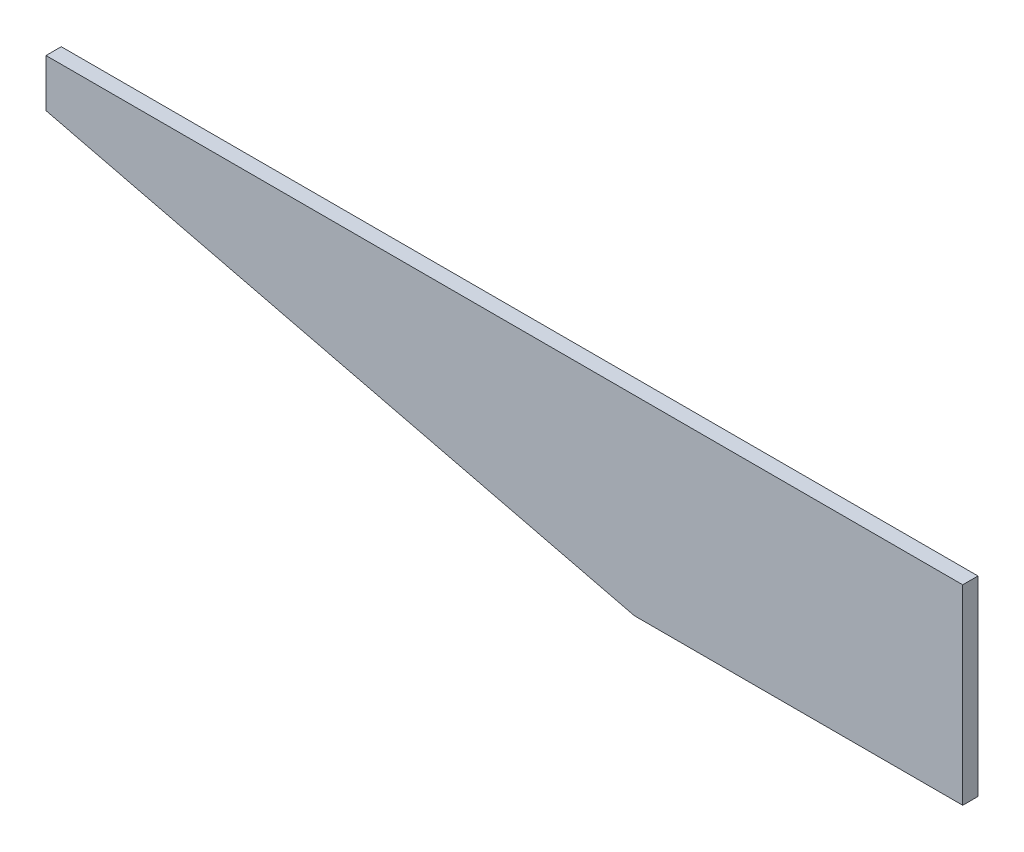
ISO-10303-21;
HEADER;
FILE_DESCRIPTION(('STEP AP214'),'2;1');
FILE_NAME('part.step','',(''),(''),'','','');
FILE_SCHEMA(('AUTOMOTIVE_DESIGN { 1 0 10303 214 1 1 1 1 }'));
ENDSEC;
DATA;
#1=APPLICATION_CONTEXT('core data for automotive mechanical design processes');
#2=APPLICATION_PROTOCOL_DEFINITION('international standard','automotive_design',2000,#1);
#3=PRODUCT_CONTEXT('',#1,'mechanical');
#4=PRODUCT('Part','Part','',(#3));
#5=PRODUCT_RELATED_PRODUCT_CATEGORY('part','',(#4));
#6=PRODUCT_DEFINITION_FORMATION('','',#4);
#7=PRODUCT_DEFINITION_CONTEXT('part definition',#1,'design');
#8=PRODUCT_DEFINITION('design','',#6,#7);
#9=PRODUCT_DEFINITION_SHAPE('','',#8);
#10=(LENGTH_UNIT() NAMED_UNIT(*) SI_UNIT(.MILLI.,.METRE.));
#11=(NAMED_UNIT(*) PLANE_ANGLE_UNIT() SI_UNIT($,.RADIAN.));
#12=(NAMED_UNIT(*) SI_UNIT($,.STERADIAN.) SOLID_ANGLE_UNIT());
#13=UNCERTAINTY_MEASURE_WITH_UNIT(LENGTH_MEASURE(1.E-05),#10,'distance_accuracy_value','');
#14=(GEOMETRIC_REPRESENTATION_CONTEXT(3) GLOBAL_UNCERTAINTY_ASSIGNED_CONTEXT((#13)) GLOBAL_UNIT_ASSIGNED_CONTEXT((#10,
#11,#12)) REPRESENTATION_CONTEXT('',''));
#15=CARTESIAN_POINT('',(0.,0.,0.));
#16=DIRECTION('',(0.,0.,1.));
#17=DIRECTION('',(1.,0.,0.));
#18=AXIS2_PLACEMENT_3D('',#15,#16,#17);
#19=CARTESIAN_POINT('',(-600.,-31.25,-10.));
#20=DIRECTION('',(-1.,0.,0.));
#21=DIRECTION('',(0.,0.,1.));
#22=AXIS2_PLACEMENT_3D('',#19,#20,#21);
#23=PLANE('',#22);
#24=DIRECTION('',(0.,-1.,0.));
#25=VECTOR('',#24,1.);
#26=CARTESIAN_POINT('',(-600.,-31.25,0.));
#27=LINE('',#26,#25);
#28=CARTESIAN_POINT('',(-600.,0.,0.));
#29=VERTEX_POINT('',#28);
#30=CARTESIAN_POINT('',(-600.,-31.25,0.));
#31=VERTEX_POINT('',#30);
#32=EDGE_CURVE('E111',#29,#31,#27,.T.);
#33=ORIENTED_EDGE('',*,*,#32,.F.);
#34=DIRECTION('',(0.,0.,1.));
#35=VECTOR('',#34,1.);
#36=CARTESIAN_POINT('',(-600.,0.,-10.));
#37=LINE('',#36,#35);
#38=CARTESIAN_POINT('',(-600.,0.,-10.));
#39=VERTEX_POINT('',#38);
#40=EDGE_CURVE('E11',#39,#29,#37,.T.);
#41=ORIENTED_EDGE('',*,*,#40,.F.);
#42=DIRECTION('',(0.,-1.,0.));
#43=VECTOR('',#42,1.);
#44=CARTESIAN_POINT('',(-600.,-31.25,-10.));
#45=LINE('',#44,#43);
#46=CARTESIAN_POINT('',(-600.,-31.25,-10.));
#47=VERTEX_POINT('',#46);
#48=EDGE_CURVE('E106',#39,#47,#45,.T.);
#49=ORIENTED_EDGE('',*,*,#48,.T.);
#50=DIRECTION('',(0.,0.,1.));
#51=VECTOR('',#50,1.);
#52=CARTESIAN_POINT('',(-600.,-31.25,-10.));
#53=LINE('',#52,#51);
#54=EDGE_CURVE('E37',#47,#31,#53,.T.);
#55=ORIENTED_EDGE('',*,*,#54,.T.);
#56=EDGE_LOOP('',(#33,#41,#49,#55));
#57=FACE_BOUND('',#56,.T.);
#58=ADVANCED_FACE('F34',(#57),#23,.T.);
#59=CARTESIAN_POINT('',(-600.,0.,-10.));
#60=DIRECTION('',(0.,1.,0.));
#61=DIRECTION('',(0.,0.,1.));
#62=AXIS2_PLACEMENT_3D('',#59,#60,#61);
#63=PLANE('',#62);
#64=DIRECTION('',(-1.,0.,0.));
#65=VECTOR('',#64,1.);
#66=CARTESIAN_POINT('',(-600.,0.,0.));
#67=LINE('',#66,#65);
#68=CARTESIAN_POINT('',(0.,0.,0.));
#69=VERTEX_POINT('',#68);
#70=EDGE_CURVE('E120',#69,#29,#67,.T.);
#71=ORIENTED_EDGE('',*,*,#70,.F.);
#72=DIRECTION('',(0.,0.,1.));
#73=VECTOR('',#72,1.);
#74=CARTESIAN_POINT('',(0.,0.,-10.));
#75=LINE('',#74,#73);
#76=CARTESIAN_POINT('',(0.,0.,-10.));
#77=VERTEX_POINT('',#76);
#78=EDGE_CURVE('E43',#77,#69,#75,.T.);
#79=ORIENTED_EDGE('',*,*,#78,.F.);
#80=DIRECTION('',(-1.,0.,0.));
#81=VECTOR('',#80,1.);
#82=CARTESIAN_POINT('',(-600.,0.,-10.));
#83=LINE('',#82,#81);
#84=EDGE_CURVE('E101',#77,#39,#83,.T.);
#85=ORIENTED_EDGE('',*,*,#84,.T.);
#86=ORIENTED_EDGE('',*,*,#40,.T.);
#87=EDGE_LOOP('',(#71,#79,#85,#86));
#88=FACE_BOUND('',#87,.T.);
#89=ADVANCED_FACE('F126',(#88),#63,.T.);
#90=CARTESIAN_POINT('',(0.,0.,-10.));
#91=DIRECTION('',(1.,0.,0.));
#92=DIRECTION('',(0.,1.,0.));
#93=AXIS2_PLACEMENT_3D('',#90,#91,#92);
#94=PLANE('',#93);
#95=DIRECTION('',(0.,1.,0.));
#96=VECTOR('',#95,1.);
#97=CARTESIAN_POINT('',(0.,0.,0.));
#98=LINE('',#97,#96);
#99=CARTESIAN_POINT('',(0.,-125.,0.));
#100=VERTEX_POINT('',#99);
#101=EDGE_CURVE('E90',#100,#69,#98,.T.);
#102=ORIENTED_EDGE('',*,*,#101,.F.);
#103=DIRECTION('',(0.,0.,1.));
#104=VECTOR('',#103,1.);
#105=CARTESIAN_POINT('',(0.,-125.,-10.));
#106=LINE('',#105,#104);
#107=CARTESIAN_POINT('',(0.,-125.,-10.));
#108=VERTEX_POINT('',#107);
#109=EDGE_CURVE('E85',#108,#100,#106,.T.);
#110=ORIENTED_EDGE('',*,*,#109,.F.);
#111=DIRECTION('',(0.,1.,0.));
#112=VECTOR('',#111,1.);
#113=CARTESIAN_POINT('',(0.,0.,-10.));
#114=LINE('',#113,#112);
#115=EDGE_CURVE('E88',#108,#77,#114,.T.);
#116=ORIENTED_EDGE('',*,*,#115,.T.);
#117=ORIENTED_EDGE('',*,*,#78,.T.);
#118=EDGE_LOOP('',(#102,#110,#116,#117));
#119=FACE_BOUND('',#118,.T.);
#120=ADVANCED_FACE('F87',(#119),#94,.T.);
#121=CARTESIAN_POINT('',(0.,-125.,-10.));
#122=DIRECTION('',(0.,-1.,0.));
#123=DIRECTION('',(1.,0.,0.));
#124=AXIS2_PLACEMENT_3D('',#121,#122,#123);
#125=PLANE('',#124);
#126=DIRECTION('',(1.,0.,0.));
#127=VECTOR('',#126,1.);
#128=CARTESIAN_POINT('',(0.,-125.,0.));
#129=LINE('',#128,#127);
#130=CARTESIAN_POINT('',(-215.,-125.,0.));
#131=VERTEX_POINT('',#130);
#132=EDGE_CURVE('E117',#131,#100,#129,.T.);
#133=ORIENTED_EDGE('',*,*,#132,.F.);
#134=DIRECTION('',(0.,0.,1.));
#135=VECTOR('',#134,1.);
#136=CARTESIAN_POINT('',(-215.,-125.,-10.));
#137=LINE('',#136,#135);
#138=CARTESIAN_POINT('',(-215.,-125.,-10.));
#139=VERTEX_POINT('',#138);
#140=EDGE_CURVE('E95',#139,#131,#137,.T.);
#141=ORIENTED_EDGE('',*,*,#140,.F.);
#142=DIRECTION('',(1.,0.,0.));
#143=VECTOR('',#142,1.);
#144=CARTESIAN_POINT('',(0.,-125.,-10.));
#145=LINE('',#144,#143);
#146=EDGE_CURVE('E100',#139,#108,#145,.T.);
#147=ORIENTED_EDGE('',*,*,#146,.T.);
#148=ORIENTED_EDGE('',*,*,#109,.T.);
#149=EDGE_LOOP('',(#133,#141,#147,#148));
#150=FACE_BOUND('',#149,.T.);
#151=ADVANCED_FACE('F103',(#150),#125,.T.);
#152=CARTESIAN_POINT('',(-215.,-125.,-10.));
#153=DIRECTION('',(-0.236593059936909,-0.971608832807571,0.));
#154=DIRECTION('',(0.971608832807571,-0.236593059936909,0.));
#155=AXIS2_PLACEMENT_3D('',#152,#153,#154);
#156=PLANE('',#155);
#157=DIRECTION('',(0.971608832807571,-0.236593059936909,0.));
#158=VECTOR('',#157,1.);
#159=CARTESIAN_POINT('',(-215.,-125.,0.));
#160=LINE('',#159,#158);
#161=EDGE_CURVE('E114',#31,#131,#160,.T.);
#162=ORIENTED_EDGE('',*,*,#161,.F.);
#163=ORIENTED_EDGE('',*,*,#54,.F.);
#164=DIRECTION('',(0.971608832807571,-0.236593059936909,0.));
#165=VECTOR('',#164,1.);
#166=CARTESIAN_POINT('',(-215.,-125.,-10.));
#167=LINE('',#166,#165);
#168=EDGE_CURVE('E104',#47,#139,#167,.T.);
#169=ORIENTED_EDGE('',*,*,#168,.T.);
#170=ORIENTED_EDGE('',*,*,#140,.T.);
#171=EDGE_LOOP('',(#162,#163,#169,#170));
#172=FACE_BOUND('',#171,.T.);
#173=ADVANCED_FACE('F123',(#172),#156,.T.);
#174=CARTESIAN_POINT('',(0.,0.,-10.));
#175=DIRECTION('',(0.,0.,-1.));
#176=DIRECTION('',(-1.,0.,0.));
#177=AXIS2_PLACEMENT_3D('',#174,#175,#176);
#178=PLANE('',#177);
#179=ORIENTED_EDGE('',*,*,#48,.F.);
#180=ORIENTED_EDGE('',*,*,#84,.F.);
#181=ORIENTED_EDGE('',*,*,#115,.F.);
#182=ORIENTED_EDGE('',*,*,#146,.F.);
#183=ORIENTED_EDGE('',*,*,#168,.F.);
#184=EDGE_LOOP('',(#179,#180,#181,#182,#183));
#185=FACE_BOUND('',#184,.T.);
#186=ADVANCED_FACE('F99',(#185),#178,.T.);
#187=CARTESIAN_POINT('',(0.,0.,0.));
#188=DIRECTION('',(0.,0.,-1.));
#189=DIRECTION('',(-1.,0.,0.));
#190=AXIS2_PLACEMENT_3D('',#187,#188,#189);
#191=PLANE('',#190);
#192=ORIENTED_EDGE('',*,*,#32,.T.);
#193=ORIENTED_EDGE('',*,*,#161,.T.);
#194=ORIENTED_EDGE('',*,*,#132,.T.);
#195=ORIENTED_EDGE('',*,*,#101,.T.);
#196=ORIENTED_EDGE('',*,*,#70,.T.);
#197=EDGE_LOOP('',(#192,#193,#194,#195,#196));
#198=FACE_BOUND('',#197,.T.);
#199=ADVANCED_FACE('F125',(#198),#191,.F.);
#200=CLOSED_SHELL('',(#58,#89,#120,#151,#173,#186,#199));
#201=MANIFOLD_SOLID_BREP('B2',#200);
#202=ADVANCED_BREP_SHAPE_REPRESENTATION('',(#18,#201),#14);
#203=SHAPE_DEFINITION_REPRESENTATION(#9,#202);
ENDSEC;
END-ISO-10303-21;
